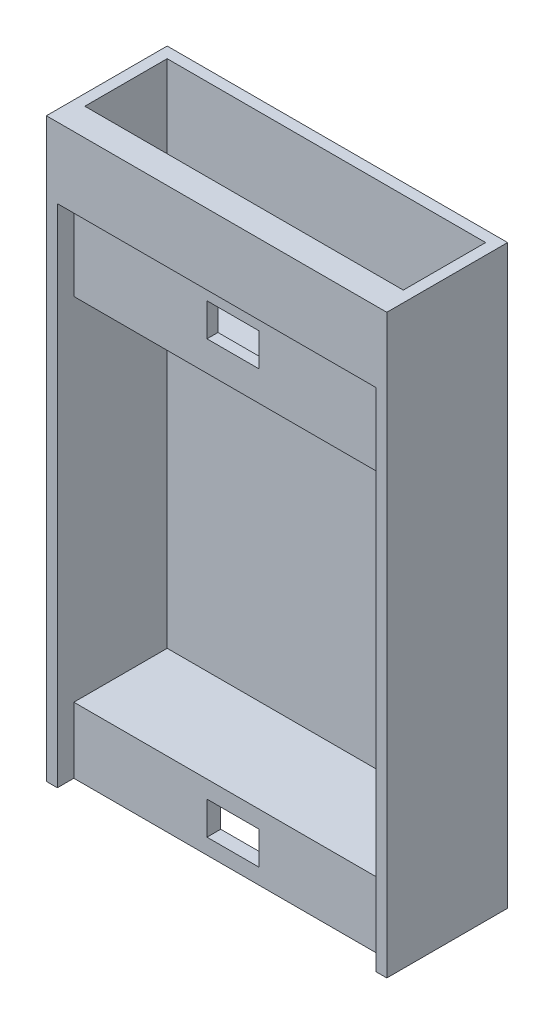
ISO-10303-21;
HEADER;
FILE_DESCRIPTION(('STEP AP214'),'2;1');
FILE_NAME('part.step','',(''),(''),'','','');
FILE_SCHEMA(('AUTOMOTIVE_DESIGN { 1 0 10303 214 1 1 1 1 }'));
ENDSEC;
DATA;
#1=APPLICATION_CONTEXT('core data for automotive mechanical design processes');
#2=APPLICATION_PROTOCOL_DEFINITION('international standard','automotive_design',2000,#1);
#3=PRODUCT_CONTEXT('',#1,'mechanical');
#4=PRODUCT('Part','Part','',(#3));
#5=PRODUCT_RELATED_PRODUCT_CATEGORY('part','',(#4));
#6=PRODUCT_DEFINITION_FORMATION('','',#4);
#7=PRODUCT_DEFINITION_CONTEXT('part definition',#1,'design');
#8=PRODUCT_DEFINITION('design','',#6,#7);
#9=PRODUCT_DEFINITION_SHAPE('','',#8);
#10=(LENGTH_UNIT() NAMED_UNIT(*) SI_UNIT(.MILLI.,.METRE.));
#11=(NAMED_UNIT(*) PLANE_ANGLE_UNIT() SI_UNIT($,.RADIAN.));
#12=(NAMED_UNIT(*) SI_UNIT($,.STERADIAN.) SOLID_ANGLE_UNIT());
#13=UNCERTAINTY_MEASURE_WITH_UNIT(LENGTH_MEASURE(1.E-05),#10,'distance_accuracy_value','');
#14=(GEOMETRIC_REPRESENTATION_CONTEXT(3) GLOBAL_UNCERTAINTY_ASSIGNED_CONTEXT((#13)) GLOBAL_UNIT_ASSIGNED_CONTEXT((#10,
#11,#12)) REPRESENTATION_CONTEXT('',''));
#15=CARTESIAN_POINT('',(0.,0.,0.));
#16=DIRECTION('',(0.,0.,1.));
#17=DIRECTION('',(1.,0.,0.));
#18=AXIS2_PLACEMENT_3D('',#15,#16,#17);
#19=CARTESIAN_POINT('',(29.,37.,20.));
#20=DIRECTION('',(0.,-1.,0.));
#21=DIRECTION('',(1.,0.,0.));
#22=AXIS2_PLACEMENT_3D('',#19,#20,#21);
#23=PLANE('',#22);
#24=CARTESIAN_POINT('',(-20.4881584976372,37.,8.76762376643871));
#25=DIRECTION('',(0.,-1.,0.));
#26=DIRECTION('',(1.,0.,0.));
#27=AXIS2_PLACEMENT_3D('',#24,#25,#26);
#28=CIRCLE('',#27,3.31314294563733);
#29=CARTESIAN_POINT('',(-17.1750155519999,37.,8.76762376643871));
#30=VERTEX_POINT('',#29);
#31=EDGE_CURVE('E388',#30,#30,#28,.T.);
#32=ORIENTED_EDGE('',*,*,#31,.F.);
#33=EDGE_LOOP('',(#32));
#34=FACE_BOUND('',#33,.T.);
#35=DIRECTION('',(0.,0.,-1.));
#36=VECTOR('',#35,1.);
#37=CARTESIAN_POINT('',(29.,37.,20.));
#38=LINE('',#37,#36);
#39=CARTESIAN_POINT('',(29.,37.,17.));
#40=VERTEX_POINT('',#39);
#41=CARTESIAN_POINT('',(29.,37.,0.));
#42=VERTEX_POINT('',#41);
#43=EDGE_CURVE('E415',#40,#42,#38,.T.);
#44=ORIENTED_EDGE('',*,*,#43,.F.);
#45=DIRECTION('',(-1.,0.,0.));
#46=VECTOR('',#45,1.);
#47=CARTESIAN_POINT('',(29.,37.,17.));
#48=LINE('',#47,#46);
#49=CARTESIAN_POINT('',(-29.,37.,17.));
#50=VERTEX_POINT('',#49);
#51=EDGE_CURVE('E305',#40,#50,#48,.T.);
#52=ORIENTED_EDGE('',*,*,#51,.T.);
#53=DIRECTION('',(0.,0.,-1.));
#54=VECTOR('',#53,1.);
#55=CARTESIAN_POINT('',(-29.,37.,20.));
#56=LINE('',#55,#54);
#57=CARTESIAN_POINT('',(-29.,37.,0.));
#58=VERTEX_POINT('',#57);
#59=EDGE_CURVE('E413',#50,#58,#56,.T.);
#60=ORIENTED_EDGE('',*,*,#59,.T.);
#61=DIRECTION('',(-1.,0.,0.));
#62=VECTOR('',#61,1.);
#63=CARTESIAN_POINT('',(29.,37.,0.));
#64=LINE('',#63,#62);
#65=EDGE_CURVE('E402',#42,#58,#64,.T.);
#66=ORIENTED_EDGE('',*,*,#65,.F.);
#67=EDGE_LOOP('',(#44,#52,#60,#66));
#68=FACE_BOUND('',#67,.T.);
#69=ADVANCED_FACE('F35',(#34,#68),#23,.T.);
#70=CARTESIAN_POINT('',(29.,-27.,20.));
#71=DIRECTION('',(0.,1.,0.));
#72=DIRECTION('',(-1.,0.,0.));
#73=AXIS2_PLACEMENT_3D('',#70,#71,#72);
#74=PLANE('',#73);
#75=DIRECTION('',(0.,0.,-1.));
#76=VECTOR('',#75,1.);
#77=CARTESIAN_POINT('',(-29.,-27.,20.));
#78=LINE('',#77,#76);
#79=CARTESIAN_POINT('',(-29.,-27.,17.));
#80=VERTEX_POINT('',#79);
#81=CARTESIAN_POINT('',(-29.,-27.,0.));
#82=VERTEX_POINT('',#81);
#83=EDGE_CURVE('E411',#80,#82,#78,.T.);
#84=ORIENTED_EDGE('',*,*,#83,.F.);
#85=DIRECTION('',(1.,0.,0.));
#86=VECTOR('',#85,1.);
#87=CARTESIAN_POINT('',(29.,-27.,17.));
#88=LINE('',#87,#86);
#89=CARTESIAN_POINT('',(29.,-27.,17.));
#90=VERTEX_POINT('',#89);
#91=EDGE_CURVE('E11',#80,#90,#88,.T.);
#92=ORIENTED_EDGE('',*,*,#91,.T.);
#93=DIRECTION('',(0.,0.,-1.));
#94=VECTOR('',#93,1.);
#95=CARTESIAN_POINT('',(29.,-27.,20.));
#96=LINE('',#95,#94);
#97=CARTESIAN_POINT('',(29.,-27.,0.));
#98=VERTEX_POINT('',#97);
#99=EDGE_CURVE('E399',#90,#98,#96,.T.);
#100=ORIENTED_EDGE('',*,*,#99,.T.);
#101=DIRECTION('',(1.,0.,0.));
#102=VECTOR('',#101,1.);
#103=CARTESIAN_POINT('',(29.,-27.,0.));
#104=LINE('',#103,#102);
#105=EDGE_CURVE('E397',#82,#98,#104,.T.);
#106=ORIENTED_EDGE('',*,*,#105,.F.);
#107=EDGE_LOOP('',(#84,#92,#100,#106));
#108=FACE_BOUND('',#107,.T.);
#109=ADVANCED_FACE('F470',(#108),#74,.T.);
#110=CARTESIAN_POINT('',(-31.,-39.,-2.));
#111=DIRECTION('',(0.,-1.,0.));
#112=DIRECTION('',(0.,0.,-1.));
#113=AXIS2_PLACEMENT_3D('',#110,#111,#112);
#114=PLANE('',#113);
#115=DIRECTION('',(0.,0.,1.));
#116=VECTOR('',#115,1.);
#117=CARTESIAN_POINT('',(-29.,-39.,17.));
#118=LINE('',#117,#116);
#119=CARTESIAN_POINT('',(-29.,-39.,17.));
#120=VERTEX_POINT('',#119);
#121=CARTESIAN_POINT('',(-29.,-39.,20.));
#122=VERTEX_POINT('',#121);
#123=EDGE_CURVE('E299',#120,#122,#118,.T.);
#124=ORIENTED_EDGE('',*,*,#123,.T.);
#125=DIRECTION('',(1.,0.,0.));
#126=VECTOR('',#125,1.);
#127=CARTESIAN_POINT('',(-31.,-39.,20.));
#128=LINE('',#127,#126);
#129=CARTESIAN_POINT('',(-31.,-39.,20.));
#130=VERTEX_POINT('',#129);
#131=EDGE_CURVE('E421',#130,#122,#128,.T.);
#132=ORIENTED_EDGE('',*,*,#131,.F.);
#133=DIRECTION('',(0.,0.,1.));
#134=VECTOR('',#133,1.);
#135=CARTESIAN_POINT('',(-31.,-39.,-2.));
#136=LINE('',#135,#134);
#137=CARTESIAN_POINT('',(-31.,-39.,-2.));
#138=VERTEX_POINT('',#137);
#139=EDGE_CURVE('E435',#138,#130,#136,.T.);
#140=ORIENTED_EDGE('',*,*,#139,.F.);
#141=DIRECTION('',(1.,0.,0.));
#142=VECTOR('',#141,1.);
#143=CARTESIAN_POINT('',(-31.,-39.,-2.));
#144=LINE('',#143,#142);
#145=CARTESIAN_POINT('',(31.,-39.,-2.));
#146=VERTEX_POINT('',#145);
#147=EDGE_CURVE('E430',#138,#146,#144,.T.);
#148=ORIENTED_EDGE('',*,*,#147,.T.);
#149=DIRECTION('',(0.,0.,1.));
#150=VECTOR('',#149,1.);
#151=CARTESIAN_POINT('',(31.,-39.,-2.));
#152=LINE('',#151,#150);
#153=CARTESIAN_POINT('',(31.,-39.,20.));
#154=VERTEX_POINT('',#153);
#155=EDGE_CURVE('E43',#146,#154,#152,.T.);
#156=ORIENTED_EDGE('',*,*,#155,.T.);
#157=CARTESIAN_POINT('',(29.,-39.,20.));
#158=VERTEX_POINT('',#157);
#159=EDGE_CURVE('E420',#158,#154,#128,.T.);
#160=ORIENTED_EDGE('',*,*,#159,.F.);
#161=DIRECTION('',(0.,0.,1.));
#162=VECTOR('',#161,1.);
#163=CARTESIAN_POINT('',(29.,-39.,17.));
#164=LINE('',#163,#162);
#165=CARTESIAN_POINT('',(29.,-39.,17.));
#166=VERTEX_POINT('',#165);
#167=EDGE_CURVE('E309',#166,#158,#164,.T.);
#168=ORIENTED_EDGE('',*,*,#167,.F.);
#169=DIRECTION('',(1.,0.,0.));
#170=VECTOR('',#169,1.);
#171=CARTESIAN_POINT('',(-29.,-39.,17.));
#172=LINE('',#171,#170);
#173=EDGE_CURVE('E289',#120,#166,#172,.T.);
#174=ORIENTED_EDGE('',*,*,#173,.F.);
#175=EDGE_LOOP('',(#124,#132,#140,#148,#156,#160,#168,#174));
#176=FACE_BOUND('',#175,.T.);
#177=DIRECTION('',(0.,0.,-1.));
#178=VECTOR('',#177,1.);
#179=CARTESIAN_POINT('',(-29.,-39.,14.5));
#180=LINE('',#179,#178);
#181=CARTESIAN_POINT('',(-29.,-39.,14.5));
#182=VERTEX_POINT('',#181);
#183=CARTESIAN_POINT('',(-29.,-39.,0.));
#184=VERTEX_POINT('',#183);
#185=EDGE_CURVE('E347',#182,#184,#180,.T.);
#186=ORIENTED_EDGE('',*,*,#185,.F.);
#187=DIRECTION('',(1.,0.,0.));
#188=VECTOR('',#187,1.);
#189=CARTESIAN_POINT('',(28.873853322182,-39.,14.5));
#190=LINE('',#189,#188);
#191=CARTESIAN_POINT('',(28.873853322182,-39.,14.5));
#192=VERTEX_POINT('',#191);
#193=EDGE_CURVE('E333',#182,#192,#190,.T.);
#194=ORIENTED_EDGE('',*,*,#193,.T.);
#195=DIRECTION('',(0.,0.,-1.));
#196=VECTOR('',#195,1.);
#197=CARTESIAN_POINT('',(28.873853322182,-39.,14.5));
#198=LINE('',#197,#196);
#199=CARTESIAN_POINT('',(28.873853322182,-39.,0.));
#200=VERTEX_POINT('',#199);
#201=EDGE_CURVE('E336',#192,#200,#198,.T.);
#202=ORIENTED_EDGE('',*,*,#201,.T.);
#203=DIRECTION('',(1.,0.,0.));
#204=VECTOR('',#203,1.);
#205=CARTESIAN_POINT('',(28.873853322182,-39.,0.));
#206=LINE('',#205,#204);
#207=EDGE_CURVE('E329',#184,#200,#206,.T.);
#208=ORIENTED_EDGE('',*,*,#207,.F.);
#209=EDGE_LOOP('',(#186,#194,#202,#208));
#210=FACE_BOUND('',#209,.T.);
#211=ADVANCED_FACE('F442',(#176,#210),#114,.T.);
#212=CARTESIAN_POINT('',(-31.,39.,-2.));
#213=DIRECTION('',(0.,1.,0.));
#214=DIRECTION('',(0.,0.,1.));
#215=AXIS2_PLACEMENT_3D('',#212,#213,#214);
#216=PLANE('',#215);
#217=DIRECTION('',(-1.,0.,0.));
#218=VECTOR('',#217,1.);
#219=CARTESIAN_POINT('',(29.,39.,15.));
#220=LINE('',#219,#218);
#221=CARTESIAN_POINT('',(29.,39.,15.));
#222=VERTEX_POINT('',#221);
#223=CARTESIAN_POINT('',(-29.,39.,15.));
#224=VERTEX_POINT('',#223);
#225=EDGE_CURVE('E318',#222,#224,#220,.T.);
#226=ORIENTED_EDGE('',*,*,#225,.F.);
#227=DIRECTION('',(0.,0.,-1.));
#228=VECTOR('',#227,1.);
#229=CARTESIAN_POINT('',(29.,39.,20.));
#230=LINE('',#229,#228);
#231=CARTESIAN_POINT('',(29.,39.,0.));
#232=VERTEX_POINT('',#231);
#233=EDGE_CURVE('E358',#222,#232,#230,.T.);
#234=ORIENTED_EDGE('',*,*,#233,.T.);
#235=DIRECTION('',(1.,0.,0.));
#236=VECTOR('',#235,1.);
#237=CARTESIAN_POINT('',(-31.,39.,0.));
#238=LINE('',#237,#236);
#239=CARTESIAN_POINT('',(-29.,39.,0.));
#240=VERTEX_POINT('',#239);
#241=EDGE_CURVE('E372',#240,#232,#238,.T.);
#242=ORIENTED_EDGE('',*,*,#241,.F.);
#243=DIRECTION('',(0.,0.,-1.));
#244=VECTOR('',#243,1.);
#245=CARTESIAN_POINT('',(-29.,39.,20.));
#246=LINE('',#245,#244);
#247=EDGE_CURVE('E370',#224,#240,#246,.T.);
#248=ORIENTED_EDGE('',*,*,#247,.F.);
#249=EDGE_LOOP('',(#226,#234,#242,#248));
#250=FACE_BOUND('',#249,.T.);
#251=CARTESIAN_POINT('',(-20.4881584976372,39.,8.76762376643871));
#252=DIRECTION('',(0.,1.,0.));
#253=DIRECTION('',(0.,0.,1.));
#254=AXIS2_PLACEMENT_3D('',#251,#252,#253);
#255=CIRCLE('',#254,3.31314294563733);
#256=CARTESIAN_POINT('',(-20.4881584976372,39.,12.080766712076));
#257=VERTEX_POINT('',#256);
#258=EDGE_CURVE('E385',#257,#257,#255,.F.);
#259=ORIENTED_EDGE('',*,*,#258,.T.);
#260=EDGE_LOOP('',(#259));
#261=FACE_BOUND('',#260,.T.);
#262=ADVANCED_FACE('F493',(#250,#261),#216,.T.);
#263=CARTESIAN_POINT('',(-29.,66.,20.));
#264=DIRECTION('',(-1.,0.,0.));
#265=DIRECTION('',(0.,-1.,0.));
#266=AXIS2_PLACEMENT_3D('',#263,#264,#265);
#267=PLANE('',#266);
#268=DIRECTION('',(0.,0.,-1.));
#269=VECTOR('',#268,1.);
#270=CARTESIAN_POINT('',(-29.,66.,20.));
#271=LINE('',#270,#269);
#272=CARTESIAN_POINT('',(-29.,66.,15.));
#273=VERTEX_POINT('',#272);
#274=CARTESIAN_POINT('',(-29.,66.,0.));
#275=VERTEX_POINT('',#274);
#276=EDGE_CURVE('E366',#273,#275,#271,.T.);
#277=ORIENTED_EDGE('',*,*,#276,.F.);
#278=DIRECTION('',(0.,1.,0.));
#279=VECTOR('',#278,1.);
#280=CARTESIAN_POINT('',(-29.,66.,15.));
#281=LINE('',#280,#279);
#282=EDGE_CURVE('E320',#224,#273,#281,.T.);
#283=ORIENTED_EDGE('',*,*,#282,.F.);
#284=ORIENTED_EDGE('',*,*,#247,.T.);
#285=DIRECTION('',(0.,1.,0.));
#286=VECTOR('',#285,1.);
#287=CARTESIAN_POINT('',(-29.,66.,0.));
#288=LINE('',#287,#286);
#289=EDGE_CURVE('E362',#240,#275,#288,.T.);
#290=ORIENTED_EDGE('',*,*,#289,.T.);
#291=EDGE_LOOP('',(#277,#283,#284,#290));
#292=FACE_BOUND('',#291,.T.);
#293=ADVANCED_FACE('F495',(#292),#267,.F.);
#294=CARTESIAN_POINT('',(29.,39.,20.));
#295=DIRECTION('',(1.,0.,0.));
#296=DIRECTION('',(0.,0.,-1.));
#297=AXIS2_PLACEMENT_3D('',#294,#295,#296);
#298=PLANE('',#297);
#299=ORIENTED_EDGE('',*,*,#233,.F.);
#300=DIRECTION('',(0.,-1.,0.));
#301=VECTOR('',#300,1.);
#302=CARTESIAN_POINT('',(29.,66.,15.));
#303=LINE('',#302,#301);
#304=CARTESIAN_POINT('',(29.,66.,15.));
#305=VERTEX_POINT('',#304);
#306=EDGE_CURVE('E316',#305,#222,#303,.T.);
#307=ORIENTED_EDGE('',*,*,#306,.F.);
#308=DIRECTION('',(0.,0.,-1.));
#309=VECTOR('',#308,1.);
#310=CARTESIAN_POINT('',(29.,66.,20.));
#311=LINE('',#310,#309);
#312=CARTESIAN_POINT('',(29.,66.,0.));
#313=VERTEX_POINT('',#312);
#314=EDGE_CURVE('E360',#305,#313,#311,.T.);
#315=ORIENTED_EDGE('',*,*,#314,.T.);
#316=DIRECTION('',(0.,-1.,0.));
#317=VECTOR('',#316,1.);
#318=CARTESIAN_POINT('',(29.,39.,0.));
#319=LINE('',#318,#317);
#320=EDGE_CURVE('E355',#313,#232,#319,.T.);
#321=ORIENTED_EDGE('',*,*,#320,.T.);
#322=EDGE_LOOP('',(#299,#307,#315,#321));
#323=FACE_BOUND('',#322,.T.);
#324=ADVANCED_FACE('F501',(#323),#298,.F.);
#325=CARTESIAN_POINT('',(0.,0.,0.));
#326=DIRECTION('',(0.,0.,1.));
#327=DIRECTION('',(1.,0.,0.));
#328=AXIS2_PLACEMENT_3D('',#325,#326,#327);
#329=PLANE('',#328);
#330=ORIENTED_EDGE('',*,*,#241,.T.);
#331=ORIENTED_EDGE('',*,*,#320,.F.);
#332=DIRECTION('',(-1.,0.,0.));
#333=VECTOR('',#332,1.);
#334=CARTESIAN_POINT('',(-31.,66.,0.));
#335=LINE('',#334,#333);
#336=EDGE_CURVE('E377',#313,#275,#335,.T.);
#337=ORIENTED_EDGE('',*,*,#336,.T.);
#338=ORIENTED_EDGE('',*,*,#289,.F.);
#339=EDGE_LOOP('',(#330,#331,#337,#338));
#340=FACE_BOUND('',#339,.T.);
#341=ADVANCED_FACE('F467',(#340),#329,.T.);
#342=CARTESIAN_POINT('',(-31.,39.,-2.));
#343=DIRECTION('',(-1.,0.,0.));
#344=DIRECTION('',(0.,-1.,0.));
#345=AXIS2_PLACEMENT_3D('',#342,#343,#344);
#346=PLANE('',#345);
#347=DIRECTION('',(0.,-1.,0.));
#348=VECTOR('',#347,1.);
#349=CARTESIAN_POINT('',(-31.,39.,20.));
#350=LINE('',#349,#348);
#351=CARTESIAN_POINT('',(-31.,66.,20.));
#352=VERTEX_POINT('',#351);
#353=EDGE_CURVE('E417',#352,#130,#350,.T.);
#354=ORIENTED_EDGE('',*,*,#353,.F.);
#355=DIRECTION('',(0.,0.,1.));
#356=VECTOR('',#355,1.);
#357=CARTESIAN_POINT('',(-31.,66.,-2.));
#358=LINE('',#357,#356);
#359=CARTESIAN_POINT('',(-31.,66.,-2.));
#360=VERTEX_POINT('',#359);
#361=EDGE_CURVE('E382',#360,#352,#358,.T.);
#362=ORIENTED_EDGE('',*,*,#361,.F.);
#363=DIRECTION('',(0.,-1.,0.));
#364=VECTOR('',#363,1.);
#365=CARTESIAN_POINT('',(-31.,39.,-2.));
#366=LINE('',#365,#364);
#367=EDGE_CURVE('E427',#360,#138,#366,.T.);
#368=ORIENTED_EDGE('',*,*,#367,.T.);
#369=ORIENTED_EDGE('',*,*,#139,.T.);
#370=EDGE_LOOP('',(#354,#362,#368,#369));
#371=FACE_BOUND('',#370,.T.);
#372=ADVANCED_FACE('F37',(#371),#346,.T.);
#373=CARTESIAN_POINT('',(31.,39.,-2.));
#374=DIRECTION('',(1.,0.,0.));
#375=DIRECTION('',(0.,0.,-1.));
#376=AXIS2_PLACEMENT_3D('',#373,#374,#375);
#377=PLANE('',#376);
#378=DIRECTION('',(0.,0.,1.));
#379=VECTOR('',#378,1.);
#380=CARTESIAN_POINT('',(31.,66.,-2.));
#381=LINE('',#380,#379);
#382=CARTESIAN_POINT('',(31.,66.,-2.));
#383=VERTEX_POINT('',#382);
#384=CARTESIAN_POINT('',(31.,66.,20.));
#385=VERTEX_POINT('',#384);
#386=EDGE_CURVE('E376',#383,#385,#381,.T.);
#387=ORIENTED_EDGE('',*,*,#386,.T.);
#388=DIRECTION('',(0.,1.,0.));
#389=VECTOR('',#388,1.);
#390=CARTESIAN_POINT('',(31.,39.,20.));
#391=LINE('',#390,#389);
#392=EDGE_CURVE('E424',#154,#385,#391,.T.);
#393=ORIENTED_EDGE('',*,*,#392,.F.);
#394=ORIENTED_EDGE('',*,*,#155,.F.);
#395=DIRECTION('',(0.,1.,0.));
#396=VECTOR('',#395,1.);
#397=CARTESIAN_POINT('',(31.,39.,-2.));
#398=LINE('',#397,#396);
#399=EDGE_CURVE('E433',#146,#383,#398,.T.);
#400=ORIENTED_EDGE('',*,*,#399,.T.);
#401=EDGE_LOOP('',(#387,#393,#394,#400));
#402=FACE_BOUND('',#401,.T.);
#403=ADVANCED_FACE('F459',(#402),#377,.T.);
#404=CARTESIAN_POINT('',(0.,0.,-2.));
#405=DIRECTION('',(0.,0.,1.));
#406=DIRECTION('',(1.,0.,0.));
#407=AXIS2_PLACEMENT_3D('',#404,#405,#406);
#408=PLANE('',#407);
#409=ORIENTED_EDGE('',*,*,#367,.F.);
#410=DIRECTION('',(-1.,0.,0.));
#411=VECTOR('',#410,1.);
#412=CARTESIAN_POINT('',(-31.,66.,-2.));
#413=LINE('',#412,#411);
#414=EDGE_CURVE('E373',#383,#360,#413,.T.);
#415=ORIENTED_EDGE('',*,*,#414,.F.);
#416=ORIENTED_EDGE('',*,*,#399,.F.);
#417=ORIENTED_EDGE('',*,*,#147,.F.);
#418=EDGE_LOOP('',(#409,#415,#416,#417));
#419=FACE_BOUND('',#418,.T.);
#420=ADVANCED_FACE('F455',(#419),#408,.F.);
#421=CARTESIAN_POINT('',(0.,0.,20.));
#422=DIRECTION('',(0.,0.,1.));
#423=DIRECTION('',(1.,0.,0.));
#424=AXIS2_PLACEMENT_3D('',#421,#422,#423);
#425=PLANE('',#424);
#426=ORIENTED_EDGE('',*,*,#131,.T.);
#427=DIRECTION('',(0.,-1.,0.));
#428=VECTOR('',#427,1.);
#429=CARTESIAN_POINT('',(-29.,-27.,20.));
#430=LINE('',#429,#428);
#431=CARTESIAN_POINT('',(-29.,53.1438905797938,20.));
#432=VERTEX_POINT('',#431);
#433=EDGE_CURVE('E396',#432,#122,#430,.T.);
#434=ORIENTED_EDGE('',*,*,#433,.F.);
#435=DIRECTION('',(-1.,0.,0.));
#436=VECTOR('',#435,1.);
#437=CARTESIAN_POINT('',(-29.,53.1438905797938,20.));
#438=LINE('',#437,#436);
#439=CARTESIAN_POINT('',(29.,53.1438905797938,20.));
#440=VERTEX_POINT('',#439);
#441=EDGE_CURVE('E286',#440,#432,#438,.T.);
#442=ORIENTED_EDGE('',*,*,#441,.F.);
#443=DIRECTION('',(0.,1.,0.));
#444=VECTOR('',#443,1.);
#445=CARTESIAN_POINT('',(29.,-27.,20.));
#446=LINE('',#445,#444);
#447=EDGE_CURVE('E394',#158,#440,#446,.T.);
#448=ORIENTED_EDGE('',*,*,#447,.F.);
#449=ORIENTED_EDGE('',*,*,#159,.T.);
#450=ORIENTED_EDGE('',*,*,#392,.T.);
#451=DIRECTION('',(-1.,0.,0.));
#452=VECTOR('',#451,1.);
#453=CARTESIAN_POINT('',(-29.,66.,20.));
#454=LINE('',#453,#452);
#455=EDGE_CURVE('E363',#385,#352,#454,.T.);
#456=ORIENTED_EDGE('',*,*,#455,.T.);
#457=ORIENTED_EDGE('',*,*,#353,.T.);
#458=EDGE_LOOP('',(#426,#434,#442,#448,#449,#450,#456,#457));
#459=FACE_BOUND('',#458,.T.);
#460=ADVANCED_FACE('F447',(#459),#425,.T.);
#461=CARTESIAN_POINT('',(29.,-27.,20.));
#462=DIRECTION('',(-1.,0.,0.));
#463=DIRECTION('',(0.,-1.,0.));
#464=AXIS2_PLACEMENT_3D('',#461,#462,#463);
#465=PLANE('',#464);
#466=DIRECTION('',(0.,1.,0.));
#467=VECTOR('',#466,1.);
#468=CARTESIAN_POINT('',(29.,53.1438905797938,17.));
#469=LINE('',#468,#467);
#470=CARTESIAN_POINT('',(29.,53.1438905797938,17.));
#471=VERTEX_POINT('',#470);
#472=EDGE_CURVE('E293',#40,#471,#469,.T.);
#473=ORIENTED_EDGE('',*,*,#472,.F.);
#474=ORIENTED_EDGE('',*,*,#43,.T.);
#475=DIRECTION('',(0.,1.,0.));
#476=VECTOR('',#475,1.);
#477=CARTESIAN_POINT('',(29.,-27.,0.));
#478=LINE('',#477,#476);
#479=EDGE_CURVE('E391',#98,#42,#478,.T.);
#480=ORIENTED_EDGE('',*,*,#479,.F.);
#481=ORIENTED_EDGE('',*,*,#99,.F.);
#482=EDGE_CURVE('E294',#166,#90,#469,.T.);
#483=ORIENTED_EDGE('',*,*,#482,.F.);
#484=ORIENTED_EDGE('',*,*,#167,.T.);
#485=ORIENTED_EDGE('',*,*,#447,.T.);
#486=DIRECTION('',(0.,0.,1.));
#487=VECTOR('',#486,1.);
#488=CARTESIAN_POINT('',(29.,53.1438905797938,17.));
#489=LINE('',#488,#487);
#490=EDGE_CURVE('E306',#471,#440,#489,.T.);
#491=ORIENTED_EDGE('',*,*,#490,.F.);
#492=EDGE_LOOP('',(#473,#474,#480,#481,#483,#484,#485,#491));
#493=FACE_BOUND('',#492,.T.);
#494=ADVANCED_FACE('F483',(#493),#465,.T.);
#495=CARTESIAN_POINT('',(-29.,-27.,20.));
#496=DIRECTION('',(1.,0.,0.));
#497=DIRECTION('',(0.,0.,-1.));
#498=AXIS2_PLACEMENT_3D('',#495,#496,#497);
#499=PLANE('',#498);
#500=DIRECTION('',(0.,-1.,0.));
#501=VECTOR('',#500,1.);
#502=CARTESIAN_POINT('',(-29.,53.1438905797938,17.));
#503=LINE('',#502,#501);
#504=EDGE_CURVE('E290',#80,#120,#503,.T.);
#505=ORIENTED_EDGE('',*,*,#504,.F.);
#506=ORIENTED_EDGE('',*,*,#83,.T.);
#507=DIRECTION('',(0.,-1.,0.));
#508=VECTOR('',#507,1.);
#509=CARTESIAN_POINT('',(-29.,-27.,0.));
#510=LINE('',#509,#508);
#511=EDGE_CURVE('E405',#58,#82,#510,.T.);
#512=ORIENTED_EDGE('',*,*,#511,.F.);
#513=ORIENTED_EDGE('',*,*,#59,.F.);
#514=CARTESIAN_POINT('',(-29.,53.1438905797938,17.));
#515=VERTEX_POINT('',#514);
#516=EDGE_CURVE('E287',#515,#50,#503,.T.);
#517=ORIENTED_EDGE('',*,*,#516,.F.);
#518=DIRECTION('',(0.,0.,1.));
#519=VECTOR('',#518,1.);
#520=CARTESIAN_POINT('',(-29.,53.1438905797938,17.));
#521=LINE('',#520,#519);
#522=EDGE_CURVE('E302',#515,#432,#521,.T.);
#523=ORIENTED_EDGE('',*,*,#522,.T.);
#524=ORIENTED_EDGE('',*,*,#433,.T.);
#525=ORIENTED_EDGE('',*,*,#123,.F.);
#526=EDGE_LOOP('',(#505,#506,#512,#513,#517,#523,#524,#525));
#527=FACE_BOUND('',#526,.T.);
#528=ADVANCED_FACE('F482',(#527),#499,.T.);
#529=CARTESIAN_POINT('',(0.,0.,0.));
#530=DIRECTION('',(0.,0.,1.));
#531=DIRECTION('',(1.,0.,0.));
#532=AXIS2_PLACEMENT_3D('',#529,#530,#531);
#533=PLANE('',#532);
#534=ORIENTED_EDGE('',*,*,#479,.T.);
#535=ORIENTED_EDGE('',*,*,#65,.T.);
#536=ORIENTED_EDGE('',*,*,#511,.T.);
#537=ORIENTED_EDGE('',*,*,#105,.T.);
#538=EDGE_LOOP('',(#534,#535,#536,#537));
#539=FACE_BOUND('',#538,.T.);
#540=ADVANCED_FACE('F489',(#539),#533,.T.);
#541=CARTESIAN_POINT('',(-20.4881584976372,39.001,8.76762376643871));
#542=DIRECTION('',(0.,-1.,0.));
#543=DIRECTION('',(1.,0.,0.));
#544=AXIS2_PLACEMENT_3D('',#541,#542,#543);
#545=CYLINDRICAL_SURFACE('',#544,3.31314294563733);
#546=ORIENTED_EDGE('',*,*,#258,.F.);
#547=EDGE_LOOP('',(#546));
#548=FACE_BOUND('',#547,.T.);
#549=ORIENTED_EDGE('',*,*,#31,.T.);
#550=EDGE_LOOP('',(#549));
#551=FACE_BOUND('',#550,.T.);
#552=ADVANCED_FACE('F491',(#548,#551),#545,.F.);
#553=CARTESIAN_POINT('',(-31.,66.,-2.));
#554=DIRECTION('',(0.,1.,0.));
#555=DIRECTION('',(0.,0.,1.));
#556=AXIS2_PLACEMENT_3D('',#553,#554,#555);
#557=PLANE('',#556);
#558=ORIENTED_EDGE('',*,*,#314,.F.);
#559=DIRECTION('',(1.,0.,0.));
#560=VECTOR('',#559,1.);
#561=CARTESIAN_POINT('',(29.,66.,15.));
#562=LINE('',#561,#560);
#563=EDGE_CURVE('E322',#273,#305,#562,.T.);
#564=ORIENTED_EDGE('',*,*,#563,.F.);
#565=ORIENTED_EDGE('',*,*,#276,.T.);
#566=ORIENTED_EDGE('',*,*,#336,.F.);
#567=EDGE_LOOP('',(#558,#564,#565,#566));
#568=FACE_BOUND('',#567,.T.);
#569=ORIENTED_EDGE('',*,*,#455,.F.);
#570=ORIENTED_EDGE('',*,*,#386,.F.);
#571=ORIENTED_EDGE('',*,*,#414,.T.);
#572=ORIENTED_EDGE('',*,*,#361,.T.);
#573=EDGE_LOOP('',(#569,#570,#571,#572));
#574=FACE_BOUND('',#573,.T.);
#575=ADVANCED_FACE('F451',(#568,#574),#557,.T.);
#576=CARTESIAN_POINT('',(28.873853322182,-29.,14.5));
#577=DIRECTION('',(-1.,0.,0.));
#578=DIRECTION('',(0.,0.,1.));
#579=AXIS2_PLACEMENT_3D('',#576,#577,#578);
#580=PLANE('',#579);
#581=DIRECTION('',(0.,1.,0.));
#582=VECTOR('',#581,1.);
#583=CARTESIAN_POINT('',(28.873853322182,-29.,0.));
#584=LINE('',#583,#582);
#585=CARTESIAN_POINT('',(28.873853322182,-29.,0.));
#586=VERTEX_POINT('',#585);
#587=EDGE_CURVE('E324',#200,#586,#584,.T.);
#588=ORIENTED_EDGE('',*,*,#587,.F.);
#589=ORIENTED_EDGE('',*,*,#201,.F.);
#590=DIRECTION('',(0.,1.,0.));
#591=VECTOR('',#590,1.);
#592=CARTESIAN_POINT('',(28.873853322182,-29.,14.5));
#593=LINE('',#592,#591);
#594=CARTESIAN_POINT('',(28.873853322182,-29.,14.5));
#595=VERTEX_POINT('',#594);
#596=EDGE_CURVE('E325',#192,#595,#593,.T.);
#597=ORIENTED_EDGE('',*,*,#596,.T.);
#598=DIRECTION('',(0.,0.,-1.));
#599=VECTOR('',#598,1.);
#600=CARTESIAN_POINT('',(28.873853322182,-29.,14.5));
#601=LINE('',#600,#599);
#602=EDGE_CURVE('E352',#595,#586,#601,.T.);
#603=ORIENTED_EDGE('',*,*,#602,.T.);
#604=EDGE_LOOP('',(#588,#589,#597,#603));
#605=FACE_BOUND('',#604,.T.);
#606=ADVANCED_FACE('F516',(#605),#580,.T.);
#607=CARTESIAN_POINT('',(28.873853322182,-29.,14.5));
#608=DIRECTION('',(0.,-1.,0.));
#609=DIRECTION('',(1.,0.,0.));
#610=AXIS2_PLACEMENT_3D('',#607,#608,#609);
#611=PLANE('',#610);
#612=DIRECTION('',(-1.,0.,0.));
#613=VECTOR('',#612,1.);
#614=CARTESIAN_POINT('',(28.873853322182,-29.,0.));
#615=LINE('',#614,#613);
#616=CARTESIAN_POINT('',(-29.,-29.,0.));
#617=VERTEX_POINT('',#616);
#618=EDGE_CURVE('E339',#586,#617,#615,.T.);
#619=ORIENTED_EDGE('',*,*,#618,.F.);
#620=ORIENTED_EDGE('',*,*,#602,.F.);
#621=DIRECTION('',(-1.,0.,0.));
#622=VECTOR('',#621,1.);
#623=CARTESIAN_POINT('',(28.873853322182,-29.,14.5));
#624=LINE('',#623,#622);
#625=CARTESIAN_POINT('',(-29.,-29.,14.5));
#626=VERTEX_POINT('',#625);
#627=EDGE_CURVE('E328',#595,#626,#624,.T.);
#628=ORIENTED_EDGE('',*,*,#627,.T.);
#629=DIRECTION('',(0.,0.,-1.));
#630=VECTOR('',#629,1.);
#631=CARTESIAN_POINT('',(-29.,-29.,14.5));
#632=LINE('',#631,#630);
#633=EDGE_CURVE('E349',#626,#617,#632,.T.);
#634=ORIENTED_EDGE('',*,*,#633,.T.);
#635=EDGE_LOOP('',(#619,#620,#628,#634));
#636=FACE_BOUND('',#635,.T.);
#637=ADVANCED_FACE('F528',(#636),#611,.T.);
#638=CARTESIAN_POINT('',(-29.,-29.,14.5));
#639=DIRECTION('',(1.,0.,0.));
#640=DIRECTION('',(0.,0.,-1.));
#641=AXIS2_PLACEMENT_3D('',#638,#639,#640);
#642=PLANE('',#641);
#643=DIRECTION('',(0.,-1.,0.));
#644=VECTOR('',#643,1.);
#645=CARTESIAN_POINT('',(-29.,-29.,0.));
#646=LINE('',#645,#644);
#647=EDGE_CURVE('E341',#617,#184,#646,.T.);
#648=ORIENTED_EDGE('',*,*,#647,.F.);
#649=ORIENTED_EDGE('',*,*,#633,.F.);
#650=DIRECTION('',(0.,-1.,0.));
#651=VECTOR('',#650,1.);
#652=CARTESIAN_POINT('',(-29.,-29.,14.5));
#653=LINE('',#652,#651);
#654=EDGE_CURVE('E331',#626,#182,#653,.T.);
#655=ORIENTED_EDGE('',*,*,#654,.T.);
#656=ORIENTED_EDGE('',*,*,#185,.T.);
#657=EDGE_LOOP('',(#648,#649,#655,#656));
#658=FACE_BOUND('',#657,.T.);
#659=ADVANCED_FACE('F532',(#658),#642,.T.);
#660=CARTESIAN_POINT('',(0.,0.,14.5));
#661=DIRECTION('',(0.,0.,-1.));
#662=DIRECTION('',(-1.,0.,0.));
#663=AXIS2_PLACEMENT_3D('',#660,#661,#662);
#664=PLANE('',#663);
#665=DIRECTION('',(-1.,0.,0.));
#666=VECTOR('',#665,1.);
#667=CARTESIAN_POINT('',(0.,-36.1608121921754,14.5));
#668=LINE('',#667,#666);
#669=CARTESIAN_POINT('',(4.75,-36.1608121921754,14.5));
#670=VERTEX_POINT('',#669);
#671=CARTESIAN_POINT('',(-4.75,-36.1608121921754,14.5));
#672=VERTEX_POINT('',#671);
#673=EDGE_CURVE('E284',#670,#672,#668,.T.);
#674=ORIENTED_EDGE('',*,*,#673,.F.);
#675=DIRECTION('',(0.,-1.,0.));
#676=VECTOR('',#675,1.);
#677=CARTESIAN_POINT('',(4.74999999999999,0.,14.5));
#678=LINE('',#677,#676);
#679=CARTESIAN_POINT('',(4.75,-30.1608121921754,14.5));
#680=VERTEX_POINT('',#679);
#681=EDGE_CURVE('E282',#680,#670,#678,.T.);
#682=ORIENTED_EDGE('',*,*,#681,.F.);
#683=DIRECTION('',(1.,0.,0.));
#684=VECTOR('',#683,1.);
#685=CARTESIAN_POINT('',(0.,-30.1608121921754,14.5));
#686=LINE('',#685,#684);
#687=CARTESIAN_POINT('',(-4.75,-30.1608121921754,14.5));
#688=VERTEX_POINT('',#687);
#689=EDGE_CURVE('E280',#688,#680,#686,.T.);
#690=ORIENTED_EDGE('',*,*,#689,.F.);
#691=DIRECTION('',(0.,1.,0.));
#692=VECTOR('',#691,1.);
#693=CARTESIAN_POINT('',(-4.74999999999999,0.,14.5));
#694=LINE('',#693,#692);
#695=EDGE_CURVE('E278',#672,#688,#694,.T.);
#696=ORIENTED_EDGE('',*,*,#695,.F.);
#697=EDGE_LOOP('',(#674,#682,#690,#696));
#698=FACE_BOUND('',#697,.T.);
#699=ORIENTED_EDGE('',*,*,#596,.F.);
#700=ORIENTED_EDGE('',*,*,#193,.F.);
#701=ORIENTED_EDGE('',*,*,#654,.F.);
#702=ORIENTED_EDGE('',*,*,#627,.F.);
#703=EDGE_LOOP('',(#699,#700,#701,#702));
#704=FACE_BOUND('',#703,.T.);
#705=ADVANCED_FACE('F536',(#698,#704),#664,.T.);
#706=CARTESIAN_POINT('',(0.,0.,0.));
#707=DIRECTION('',(0.,0.,-1.));
#708=DIRECTION('',(-1.,0.,0.));
#709=AXIS2_PLACEMENT_3D('',#706,#707,#708);
#710=PLANE('',#709);
#711=ORIENTED_EDGE('',*,*,#587,.T.);
#712=ORIENTED_EDGE('',*,*,#618,.T.);
#713=ORIENTED_EDGE('',*,*,#647,.T.);
#714=ORIENTED_EDGE('',*,*,#207,.T.);
#715=EDGE_LOOP('',(#711,#712,#713,#714));
#716=FACE_BOUND('',#715,.T.);
#717=ADVANCED_FACE('F538',(#716),#710,.F.);
#718=CARTESIAN_POINT('',(0.,0.,15.));
#719=DIRECTION('',(0.,0.,-1.));
#720=DIRECTION('',(-1.,0.,0.));
#721=AXIS2_PLACEMENT_3D('',#718,#719,#720);
#722=PLANE('',#721);
#723=DIRECTION('',(-1.,0.,0.));
#724=VECTOR('',#723,1.);
#725=CARTESIAN_POINT('',(0.,42.4391878078246,15.));
#726=LINE('',#725,#724);
#727=CARTESIAN_POINT('',(4.75,42.4391878078246,15.));
#728=VERTEX_POINT('',#727);
#729=CARTESIAN_POINT('',(-4.75,42.4391878078246,15.));
#730=VERTEX_POINT('',#729);
#731=EDGE_CURVE('E276',#728,#730,#726,.T.);
#732=ORIENTED_EDGE('',*,*,#731,.F.);
#733=DIRECTION('',(0.,-1.,0.));
#734=VECTOR('',#733,1.);
#735=CARTESIAN_POINT('',(4.74999999999999,0.,15.));
#736=LINE('',#735,#734);
#737=CARTESIAN_POINT('',(4.75,48.4391878078246,15.));
#738=VERTEX_POINT('',#737);
#739=EDGE_CURVE('E274',#738,#728,#736,.T.);
#740=ORIENTED_EDGE('',*,*,#739,.F.);
#741=DIRECTION('',(1.,0.,0.));
#742=VECTOR('',#741,1.);
#743=CARTESIAN_POINT('',(0.,48.4391878078246,15.));
#744=LINE('',#743,#742);
#745=CARTESIAN_POINT('',(-4.75,48.4391878078246,15.));
#746=VERTEX_POINT('',#745);
#747=EDGE_CURVE('E227',#746,#738,#744,.T.);
#748=ORIENTED_EDGE('',*,*,#747,.F.);
#749=DIRECTION('',(0.,1.,0.));
#750=VECTOR('',#749,1.);
#751=CARTESIAN_POINT('',(-4.75,0.,15.));
#752=LINE('',#751,#750);
#753=EDGE_CURVE('E253',#730,#746,#752,.T.);
#754=ORIENTED_EDGE('',*,*,#753,.F.);
#755=EDGE_LOOP('',(#732,#740,#748,#754));
#756=FACE_BOUND('',#755,.T.);
#757=ORIENTED_EDGE('',*,*,#306,.T.);
#758=ORIENTED_EDGE('',*,*,#225,.T.);
#759=ORIENTED_EDGE('',*,*,#282,.T.);
#760=ORIENTED_EDGE('',*,*,#563,.T.);
#761=EDGE_LOOP('',(#757,#758,#759,#760));
#762=FACE_BOUND('',#761,.T.);
#763=ADVANCED_FACE('F541',(#756,#762),#722,.T.);
#764=CARTESIAN_POINT('',(0.,0.,17.));
#765=DIRECTION('',(0.,0.,1.));
#766=DIRECTION('',(1.,0.,0.));
#767=AXIS2_PLACEMENT_3D('',#764,#765,#766);
#768=PLANE('',#767);
#769=DIRECTION('',(1.,0.,0.));
#770=VECTOR('',#769,1.);
#771=CARTESIAN_POINT('',(-4.75,-36.1608121921754,17.));
#772=LINE('',#771,#770);
#773=CARTESIAN_POINT('',(-4.75,-36.1608121921754,17.));
#774=VERTEX_POINT('',#773);
#775=CARTESIAN_POINT('',(4.75,-36.1608121921754,17.));
#776=VERTEX_POINT('',#775);
#777=EDGE_CURVE('E260',#774,#776,#772,.T.);
#778=ORIENTED_EDGE('',*,*,#777,.F.);
#779=DIRECTION('',(0.,-1.,0.));
#780=VECTOR('',#779,1.);
#781=CARTESIAN_POINT('',(-4.75,-30.1608121921754,17.));
#782=LINE('',#781,#780);
#783=CARTESIAN_POINT('',(-4.75,-30.1608121921754,17.));
#784=VERTEX_POINT('',#783);
#785=EDGE_CURVE('E263',#784,#774,#782,.T.);
#786=ORIENTED_EDGE('',*,*,#785,.F.);
#787=DIRECTION('',(-1.,0.,0.));
#788=VECTOR('',#787,1.);
#789=CARTESIAN_POINT('',(-4.75,-30.1608121921754,17.));
#790=LINE('',#789,#788);
#791=CARTESIAN_POINT('',(4.75,-30.1608121921754,17.));
#792=VERTEX_POINT('',#791);
#793=EDGE_CURVE('E254',#792,#784,#790,.T.);
#794=ORIENTED_EDGE('',*,*,#793,.F.);
#795=DIRECTION('',(0.,1.,0.));
#796=VECTOR('',#795,1.);
#797=CARTESIAN_POINT('',(4.75,-30.1608121921754,17.));
#798=LINE('',#797,#796);
#799=EDGE_CURVE('E257',#776,#792,#798,.T.);
#800=ORIENTED_EDGE('',*,*,#799,.F.);
#801=EDGE_LOOP('',(#778,#786,#794,#800));
#802=FACE_BOUND('',#801,.T.);
#803=ORIENTED_EDGE('',*,*,#504,.T.);
#804=ORIENTED_EDGE('',*,*,#173,.T.);
#805=ORIENTED_EDGE('',*,*,#482,.T.);
#806=ORIENTED_EDGE('',*,*,#91,.F.);
#807=EDGE_LOOP('',(#803,#804,#805,#806));
#808=FACE_BOUND('',#807,.T.);
#809=ADVANCED_FACE('F548',(#802,#808),#768,.T.);
#810=DIRECTION('',(1.,0.,0.));
#811=VECTOR('',#810,1.);
#812=CARTESIAN_POINT('',(-4.75,42.4391878078246,17.));
#813=LINE('',#812,#811);
#814=CARTESIAN_POINT('',(-4.75,42.4391878078246,17.));
#815=VERTEX_POINT('',#814);
#816=CARTESIAN_POINT('',(4.75,42.4391878078246,17.));
#817=VERTEX_POINT('',#816);
#818=EDGE_CURVE('E240',#815,#817,#813,.T.);
#819=ORIENTED_EDGE('',*,*,#818,.F.);
#820=DIRECTION('',(0.,-1.,0.));
#821=VECTOR('',#820,1.);
#822=CARTESIAN_POINT('',(-4.75,48.4391878078246,17.));
#823=LINE('',#822,#821);
#824=CARTESIAN_POINT('',(-4.75,48.4391878078246,17.));
#825=VERTEX_POINT('',#824);
#826=EDGE_CURVE('E245',#825,#815,#823,.T.);
#827=ORIENTED_EDGE('',*,*,#826,.F.);
#828=DIRECTION('',(-1.,0.,0.));
#829=VECTOR('',#828,1.);
#830=CARTESIAN_POINT('',(-4.75,48.4391878078246,17.));
#831=LINE('',#830,#829);
#832=CARTESIAN_POINT('',(4.75,48.4391878078246,17.));
#833=VERTEX_POINT('',#832);
#834=EDGE_CURVE('E224',#833,#825,#831,.T.);
#835=ORIENTED_EDGE('',*,*,#834,.F.);
#836=DIRECTION('',(0.,1.,0.));
#837=VECTOR('',#836,1.);
#838=CARTESIAN_POINT('',(4.75,48.4391878078246,17.));
#839=LINE('',#838,#837);
#840=EDGE_CURVE('E234',#817,#833,#839,.T.);
#841=ORIENTED_EDGE('',*,*,#840,.F.);
#842=EDGE_LOOP('',(#819,#827,#835,#841));
#843=FACE_BOUND('',#842,.T.);
#844=ORIENTED_EDGE('',*,*,#472,.T.);
#845=DIRECTION('',(-1.,0.,0.));
#846=VECTOR('',#845,1.);
#847=CARTESIAN_POINT('',(-29.,53.1438905797938,17.));
#848=LINE('',#847,#846);
#849=EDGE_CURVE('E296',#471,#515,#848,.T.);
#850=ORIENTED_EDGE('',*,*,#849,.T.);
#851=ORIENTED_EDGE('',*,*,#516,.T.);
#852=ORIENTED_EDGE('',*,*,#51,.F.);
#853=EDGE_LOOP('',(#844,#850,#851,#852));
#854=FACE_BOUND('',#853,.T.);
#855=ADVANCED_FACE('F243',(#843,#854),#768,.T.);
#856=CARTESIAN_POINT('',(-29.,53.1438905797938,17.));
#857=DIRECTION('',(0.,1.,0.));
#858=DIRECTION('',(0.,0.,1.));
#859=AXIS2_PLACEMENT_3D('',#856,#857,#858);
#860=PLANE('',#859);
#861=ORIENTED_EDGE('',*,*,#441,.T.);
#862=ORIENTED_EDGE('',*,*,#522,.F.);
#863=ORIENTED_EDGE('',*,*,#849,.F.);
#864=ORIENTED_EDGE('',*,*,#490,.T.);
#865=EDGE_LOOP('',(#861,#862,#863,#864));
#866=FACE_BOUND('',#865,.T.);
#867=ADVANCED_FACE('F550',(#866),#860,.F.);
#868=CARTESIAN_POINT('',(-4.75,42.4391878078246,-11.2361025271221));
#869=DIRECTION('',(0.,-1.,0.));
#870=DIRECTION('',(0.,0.,-1.));
#871=AXIS2_PLACEMENT_3D('',#868,#869,#870);
#872=PLANE('',#871);
#873=ORIENTED_EDGE('',*,*,#731,.T.);
#874=DIRECTION('',(0.,0.,1.));
#875=VECTOR('',#874,1.);
#876=CARTESIAN_POINT('',(-4.75,42.4391878078246,-11.2361025271221));
#877=LINE('',#876,#875);
#878=EDGE_CURVE('E58',#730,#815,#877,.T.);
#879=ORIENTED_EDGE('',*,*,#878,.T.);
#880=ORIENTED_EDGE('',*,*,#818,.T.);
#881=DIRECTION('',(0.,0.,1.));
#882=VECTOR('',#881,1.);
#883=CARTESIAN_POINT('',(4.75,42.4391878078246,-11.2361025271221));
#884=LINE('',#883,#882);
#885=EDGE_CURVE('E231',#728,#817,#884,.T.);
#886=ORIENTED_EDGE('',*,*,#885,.F.);
#887=EDGE_LOOP('',(#873,#879,#880,#886));
#888=FACE_BOUND('',#887,.T.);
#889=ADVANCED_FACE('F553',(#888),#872,.F.);
#890=CARTESIAN_POINT('',(4.75,48.4391878078246,-11.2361025271221));
#891=DIRECTION('',(1.,0.,0.));
#892=DIRECTION('',(0.,1.,0.));
#893=AXIS2_PLACEMENT_3D('',#890,#891,#892);
#894=PLANE('',#893);
#895=ORIENTED_EDGE('',*,*,#739,.T.);
#896=ORIENTED_EDGE('',*,*,#885,.T.);
#897=ORIENTED_EDGE('',*,*,#840,.T.);
#898=DIRECTION('',(0.,0.,1.));
#899=VECTOR('',#898,1.);
#900=CARTESIAN_POINT('',(4.75,48.4391878078246,-11.2361025271221));
#901=LINE('',#900,#899);
#902=EDGE_CURVE('E219',#738,#833,#901,.T.);
#903=ORIENTED_EDGE('',*,*,#902,.F.);
#904=EDGE_LOOP('',(#895,#896,#897,#903));
#905=FACE_BOUND('',#904,.T.);
#906=ADVANCED_FACE('F235',(#905),#894,.F.);
#907=CARTESIAN_POINT('',(-4.75,48.4391878078246,-11.2361025271221));
#908=DIRECTION('',(0.,1.,0.));
#909=DIRECTION('',(0.,0.,1.));
#910=AXIS2_PLACEMENT_3D('',#907,#908,#909);
#911=PLANE('',#910);
#912=ORIENTED_EDGE('',*,*,#747,.T.);
#913=ORIENTED_EDGE('',*,*,#902,.T.);
#914=ORIENTED_EDGE('',*,*,#834,.T.);
#915=DIRECTION('',(0.,0.,1.));
#916=VECTOR('',#915,1.);
#917=CARTESIAN_POINT('',(-4.75,48.4391878078246,-11.2361025271221));
#918=LINE('',#917,#916);
#919=EDGE_CURVE('E230',#746,#825,#918,.T.);
#920=ORIENTED_EDGE('',*,*,#919,.F.);
#921=EDGE_LOOP('',(#912,#913,#914,#920));
#922=FACE_BOUND('',#921,.T.);
#923=ADVANCED_FACE('F221',(#922),#911,.F.);
#924=CARTESIAN_POINT('',(-4.75,48.4391878078246,-11.2361025271221));
#925=DIRECTION('',(-1.,0.,0.));
#926=DIRECTION('',(0.,0.,1.));
#927=AXIS2_PLACEMENT_3D('',#924,#925,#926);
#928=PLANE('',#927);
#929=ORIENTED_EDGE('',*,*,#753,.T.);
#930=ORIENTED_EDGE('',*,*,#919,.T.);
#931=ORIENTED_EDGE('',*,*,#826,.T.);
#932=ORIENTED_EDGE('',*,*,#878,.F.);
#933=EDGE_LOOP('',(#929,#930,#931,#932));
#934=FACE_BOUND('',#933,.T.);
#935=ADVANCED_FACE('F562',(#934),#928,.F.);
#936=CARTESIAN_POINT('',(-4.75,-36.1608121921754,-11.2361025271221));
#937=DIRECTION('',(0.,-1.,0.));
#938=DIRECTION('',(0.,0.,-1.));
#939=AXIS2_PLACEMENT_3D('',#936,#937,#938);
#940=PLANE('',#939);
#941=ORIENTED_EDGE('',*,*,#673,.T.);
#942=DIRECTION('',(0.,0.,1.));
#943=VECTOR('',#942,1.);
#944=CARTESIAN_POINT('',(-4.75,-36.1608121921754,-11.2361025271221));
#945=LINE('',#944,#943);
#946=EDGE_CURVE('E50',#672,#774,#945,.T.);
#947=ORIENTED_EDGE('',*,*,#946,.T.);
#948=ORIENTED_EDGE('',*,*,#777,.T.);
#949=DIRECTION('',(0.,0.,1.));
#950=VECTOR('',#949,1.);
#951=CARTESIAN_POINT('',(4.75,-36.1608121921754,-11.2361025271221));
#952=LINE('',#951,#950);
#953=EDGE_CURVE('E256',#670,#776,#952,.T.);
#954=ORIENTED_EDGE('',*,*,#953,.F.);
#955=EDGE_LOOP('',(#941,#947,#948,#954));
#956=FACE_BOUND('',#955,.T.);
#957=ADVANCED_FACE('F558',(#956),#940,.F.);
#958=CARTESIAN_POINT('',(4.75,-30.1608121921754,-11.2361025271221));
#959=DIRECTION('',(1.,0.,0.));
#960=DIRECTION('',(0.,1.,0.));
#961=AXIS2_PLACEMENT_3D('',#958,#959,#960);
#962=PLANE('',#961);
#963=ORIENTED_EDGE('',*,*,#681,.T.);
#964=ORIENTED_EDGE('',*,*,#953,.T.);
#965=ORIENTED_EDGE('',*,*,#799,.T.);
#966=DIRECTION('',(0.,0.,1.));
#967=VECTOR('',#966,1.);
#968=CARTESIAN_POINT('',(4.75,-30.1608121921754,-11.2361025271221));
#969=LINE('',#968,#967);
#970=EDGE_CURVE('E268',#680,#792,#969,.T.);
#971=ORIENTED_EDGE('',*,*,#970,.F.);
#972=EDGE_LOOP('',(#963,#964,#965,#971));
#973=FACE_BOUND('',#972,.T.);
#974=ADVANCED_FACE('F561',(#973),#962,.F.);
#975=CARTESIAN_POINT('',(-4.75,-30.1608121921754,-11.2361025271221));
#976=DIRECTION('',(0.,1.,0.));
#977=DIRECTION('',(0.,0.,1.));
#978=AXIS2_PLACEMENT_3D('',#975,#976,#977);
#979=PLANE('',#978);
#980=ORIENTED_EDGE('',*,*,#689,.T.);
#981=ORIENTED_EDGE('',*,*,#970,.T.);
#982=ORIENTED_EDGE('',*,*,#793,.T.);
#983=DIRECTION('',(0.,0.,1.));
#984=VECTOR('',#983,1.);
#985=CARTESIAN_POINT('',(-4.75,-30.1608121921754,-11.2361025271221));
#986=LINE('',#985,#984);
#987=EDGE_CURVE('E265',#688,#784,#986,.T.);
#988=ORIENTED_EDGE('',*,*,#987,.F.);
#989=EDGE_LOOP('',(#980,#981,#982,#988));
#990=FACE_BOUND('',#989,.T.);
#991=ADVANCED_FACE('F566',(#990),#979,.F.);
#992=CARTESIAN_POINT('',(-4.75,-30.1608121921754,-11.2361025271221));
#993=DIRECTION('',(-1.,0.,0.));
#994=DIRECTION('',(0.,-1.,0.));
#995=AXIS2_PLACEMENT_3D('',#992,#993,#994);
#996=PLANE('',#995);
#997=ORIENTED_EDGE('',*,*,#695,.T.);
#998=ORIENTED_EDGE('',*,*,#987,.T.);
#999=ORIENTED_EDGE('',*,*,#785,.T.);
#1000=ORIENTED_EDGE('',*,*,#946,.F.);
#1001=EDGE_LOOP('',(#997,#998,#999,#1000));
#1002=FACE_BOUND('',#1001,.T.);
#1003=ADVANCED_FACE('F570',(#1002),#996,.F.);
#1004=CLOSED_SHELL('',(#69,#109,#211,#262,#293,#324,#341,#372,#403,#420,#460,#494,#528,#540,
#552,#575,#606,#637,#659,#705,#717,#763,#809,#855,#867,#889,#906,#923,#935,#957,#974,#991,#1003));
#1005=MANIFOLD_SOLID_BREP('B2',#1004);
#1006=ADVANCED_BREP_SHAPE_REPRESENTATION('',(#18,#1005),#14);
#1007=SHAPE_DEFINITION_REPRESENTATION(#9,#1006);
ENDSEC;
END-ISO-10303-21;
